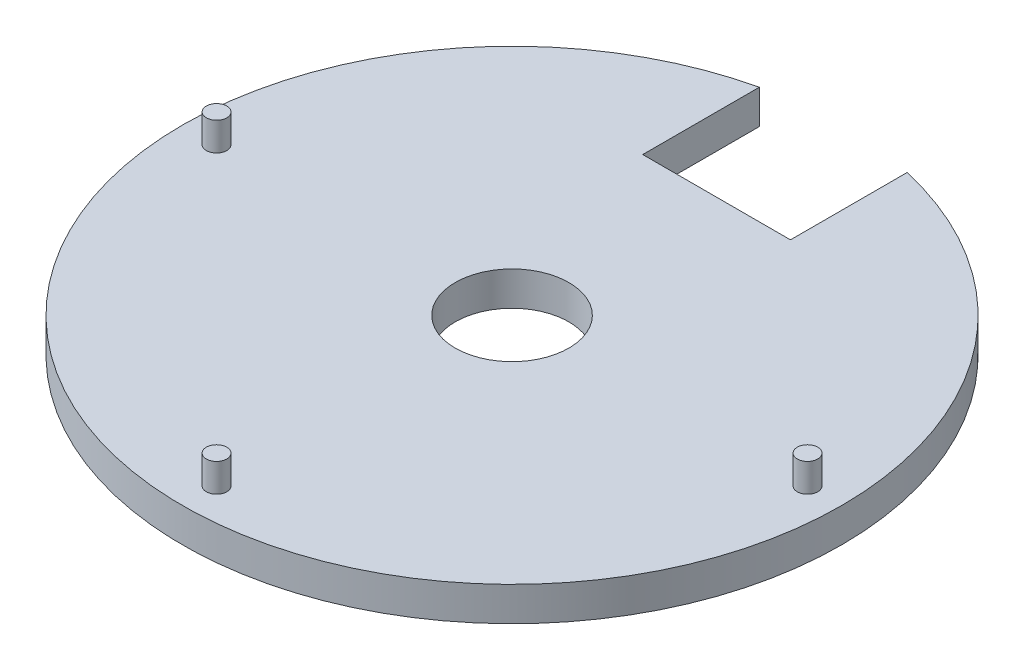
ISO-10303-21;
HEADER;
FILE_DESCRIPTION(('STEP AP214'),'2;1');
FILE_NAME('part.step','',(''),(''),'','','');
FILE_SCHEMA(('AUTOMOTIVE_DESIGN { 1 0 10303 214 1 1 1 1 }'));
ENDSEC;
DATA;
#1=APPLICATION_CONTEXT('core data for automotive mechanical design processes');
#2=APPLICATION_PROTOCOL_DEFINITION('international standard','automotive_design',2000,#1);
#3=PRODUCT_CONTEXT('',#1,'mechanical');
#4=PRODUCT('Part','Part','',(#3));
#5=PRODUCT_RELATED_PRODUCT_CATEGORY('part','',(#4));
#6=PRODUCT_DEFINITION_FORMATION('','',#4);
#7=PRODUCT_DEFINITION_CONTEXT('part definition',#1,'design');
#8=PRODUCT_DEFINITION('design','',#6,#7);
#9=PRODUCT_DEFINITION_SHAPE('','',#8);
#10=(LENGTH_UNIT() NAMED_UNIT(*) SI_UNIT(.MILLI.,.METRE.));
#11=(NAMED_UNIT(*) PLANE_ANGLE_UNIT() SI_UNIT($,.RADIAN.));
#12=(NAMED_UNIT(*) SI_UNIT($,.STERADIAN.) SOLID_ANGLE_UNIT());
#13=UNCERTAINTY_MEASURE_WITH_UNIT(LENGTH_MEASURE(1.E-05),#10,'distance_accuracy_value','');
#14=(GEOMETRIC_REPRESENTATION_CONTEXT(3) GLOBAL_UNCERTAINTY_ASSIGNED_CONTEXT((#13)) GLOBAL_UNIT_ASSIGNED_CONTEXT((#10,
#11,#12)) REPRESENTATION_CONTEXT('',''));
#15=CARTESIAN_POINT('',(0.,0.,0.));
#16=DIRECTION('',(0.,0.,1.));
#17=DIRECTION('',(1.,0.,0.));
#18=AXIS2_PLACEMENT_3D('',#15,#16,#17);
#19=CARTESIAN_POINT('',(0.,3.,0.));
#20=DIRECTION('',(0.,-1.,0.));
#21=DIRECTION('',(0.,0.,-1.));
#22=AXIS2_PLACEMENT_3D('',#19,#20,#21);
#23=CYLINDRICAL_SURFACE('',#22,29.);
#24=DIRECTION('',(0.,-1.,0.));
#25=VECTOR('',#24,1.);
#26=CARTESIAN_POINT('',(6.5,3.,-28.2621655221252));
#27=LINE('',#26,#25);
#28=CARTESIAN_POINT('',(6.5,3.,-28.2621655221252));
#29=VERTEX_POINT('',#28);
#30=CARTESIAN_POINT('',(6.5,0.,-28.2621655221252));
#31=VERTEX_POINT('',#30);
#32=EDGE_CURVE('E56',#29,#31,#27,.T.);
#33=ORIENTED_EDGE('',*,*,#32,.F.);
#34=CARTESIAN_POINT('',(0.,3.,0.));
#35=DIRECTION('',(0.,1.,0.));
#36=DIRECTION('',(0.,0.,1.));
#37=AXIS2_PLACEMENT_3D('',#34,#35,#36);
#38=CIRCLE('',#37,29.);
#39=CARTESIAN_POINT('',(-6.5,3.,-28.2621655221252));
#40=VERTEX_POINT('',#39);
#41=EDGE_CURVE('E42',#40,#29,#38,.T.);
#42=ORIENTED_EDGE('',*,*,#41,.F.);
#43=DIRECTION('',(0.,-1.,0.));
#44=VECTOR('',#43,1.);
#45=CARTESIAN_POINT('',(-6.5,3.,-28.2621655221252));
#46=LINE('',#45,#44);
#47=CARTESIAN_POINT('',(-6.5,0.,-28.2621655221252));
#48=VERTEX_POINT('',#47);
#49=EDGE_CURVE('E86',#48,#40,#46,.F.);
#50=ORIENTED_EDGE('',*,*,#49,.F.);
#51=CARTESIAN_POINT('',(0.,0.,0.));
#52=DIRECTION('',(0.,1.,0.));
#53=DIRECTION('',(0.,0.,1.));
#54=AXIS2_PLACEMENT_3D('',#51,#52,#53);
#55=CIRCLE('',#54,29.);
#56=EDGE_CURVE('E106',#48,#31,#55,.T.);
#57=ORIENTED_EDGE('',*,*,#56,.T.);
#58=EDGE_LOOP('',(#33,#42,#50,#57));
#59=FACE_BOUND('',#58,.T.);
#60=ADVANCED_FACE('F35',(#59),#23,.T.);
#61=CARTESIAN_POINT('',(0.,3.,0.));
#62=DIRECTION('',(0.,1.,0.));
#63=DIRECTION('',(0.,0.,1.));
#64=AXIS2_PLACEMENT_3D('',#61,#62,#63);
#65=PLANE('',#64);
#66=CARTESIAN_POINT('',(0.,3.,0.));
#67=DIRECTION('',(0.,1.,0.));
#68=DIRECTION('',(0.,0.,1.));
#69=AXIS2_PLACEMENT_3D('',#66,#67,#68);
#70=CIRCLE('',#69,5.);
#71=CARTESIAN_POINT('',(0.,3.,5.));
#72=VERTEX_POINT('',#71);
#73=EDGE_CURVE('E165',#72,#72,#70,.T.);
#74=ORIENTED_EDGE('',*,*,#73,.F.);
#75=EDGE_LOOP('',(#74));
#76=FACE_BOUND('',#75,.T.);
#77=CARTESIAN_POINT('',(0.,3.,26.));
#78=DIRECTION('',(0.,1.,0.));
#79=DIRECTION('',(0.,0.,1.));
#80=AXIS2_PLACEMENT_3D('',#77,#78,#79);
#81=CIRCLE('',#80,0.9);
#82=CARTESIAN_POINT('',(0.,3.,26.9));
#83=VERTEX_POINT('',#82);
#84=EDGE_CURVE('E167',#83,#83,#81,.T.);
#85=ORIENTED_EDGE('',*,*,#84,.F.);
#86=EDGE_LOOP('',(#85));
#87=FACE_BOUND('',#86,.T.);
#88=CARTESIAN_POINT('',(26.,3.,0.));
#89=DIRECTION('',(0.,1.,0.));
#90=DIRECTION('',(0.,0.,1.));
#91=AXIS2_PLACEMENT_3D('',#88,#89,#90);
#92=CIRCLE('',#91,0.9);
#93=CARTESIAN_POINT('',(26.,3.,0.9));
#94=VERTEX_POINT('',#93);
#95=EDGE_CURVE('E176',#94,#94,#92,.T.);
#96=ORIENTED_EDGE('',*,*,#95,.F.);
#97=EDGE_LOOP('',(#96));
#98=FACE_BOUND('',#97,.T.);
#99=CARTESIAN_POINT('',(-26.,3.,0.));
#100=DIRECTION('',(0.,1.,0.));
#101=DIRECTION('',(0.,0.,1.));
#102=AXIS2_PLACEMENT_3D('',#99,#100,#101);
#103=CIRCLE('',#102,0.9);
#104=CARTESIAN_POINT('',(-26.,3.,0.900000000000004));
#105=VERTEX_POINT('',#104);
#106=EDGE_CURVE('E96',#105,#105,#103,.T.);
#107=ORIENTED_EDGE('',*,*,#106,.F.);
#108=EDGE_LOOP('',(#107));
#109=FACE_BOUND('',#108,.T.);
#110=ORIENTED_EDGE('',*,*,#41,.T.);
#111=DIRECTION('',(0.,0.,1.));
#112=VECTOR('',#111,1.);
#113=CARTESIAN_POINT('',(6.5,3.,-29.));
#114=LINE('',#113,#112);
#115=CARTESIAN_POINT('',(6.5,3.,-18.));
#116=VERTEX_POINT('',#115);
#117=EDGE_CURVE('E99',#29,#116,#114,.T.);
#118=ORIENTED_EDGE('',*,*,#117,.T.);
#119=DIRECTION('',(-1.,0.,0.));
#120=VECTOR('',#119,1.);
#121=CARTESIAN_POINT('',(6.5,3.,-18.));
#122=LINE('',#121,#120);
#123=CARTESIAN_POINT('',(-6.5,3.,-18.));
#124=VERTEX_POINT('',#123);
#125=EDGE_CURVE('E84',#116,#124,#122,.T.);
#126=ORIENTED_EDGE('',*,*,#125,.T.);
#127=DIRECTION('',(0.,0.,-1.));
#128=VECTOR('',#127,1.);
#129=CARTESIAN_POINT('',(-6.5,3.,-18.));
#130=LINE('',#129,#128);
#131=EDGE_CURVE('E90',#124,#40,#130,.T.);
#132=ORIENTED_EDGE('',*,*,#131,.T.);
#133=EDGE_LOOP('',(#110,#118,#126,#132));
#134=FACE_BOUND('',#133,.T.);
#135=ADVANCED_FACE('F113',(#76,#87,#98,#109,#134),#65,.T.);
#136=CARTESIAN_POINT('',(0.,0.,0.));
#137=DIRECTION('',(0.,1.,0.));
#138=DIRECTION('',(0.,0.,1.));
#139=AXIS2_PLACEMENT_3D('',#136,#137,#138);
#140=PLANE('',#139);
#141=CARTESIAN_POINT('',(0.,0.,0.));
#142=DIRECTION('',(0.,1.,0.));
#143=DIRECTION('',(0.,0.,1.));
#144=AXIS2_PLACEMENT_3D('',#141,#142,#143);
#145=CIRCLE('',#144,5.);
#146=CARTESIAN_POINT('',(0.,0.,5.));
#147=VERTEX_POINT('',#146);
#148=EDGE_CURVE('E163',#147,#147,#145,.T.);
#149=ORIENTED_EDGE('',*,*,#148,.T.);
#150=EDGE_LOOP('',(#149));
#151=FACE_BOUND('',#150,.T.);
#152=DIRECTION('',(0.,0.,1.));
#153=VECTOR('',#152,1.);
#154=CARTESIAN_POINT('',(6.5,0.,0.));
#155=LINE('',#154,#153);
#156=CARTESIAN_POINT('',(6.5,0.,-18.));
#157=VERTEX_POINT('',#156);
#158=EDGE_CURVE('E11',#31,#157,#155,.T.);
#159=ORIENTED_EDGE('',*,*,#158,.F.);
#160=ORIENTED_EDGE('',*,*,#56,.F.);
#161=DIRECTION('',(0.,0.,-1.));
#162=VECTOR('',#161,1.);
#163=CARTESIAN_POINT('',(-6.5,0.,-18.));
#164=LINE('',#163,#162);
#165=CARTESIAN_POINT('',(-6.5,0.,-18.));
#166=VERTEX_POINT('',#165);
#167=EDGE_CURVE('E89',#166,#48,#164,.T.);
#168=ORIENTED_EDGE('',*,*,#167,.F.);
#169=DIRECTION('',(-1.,0.,0.));
#170=VECTOR('',#169,1.);
#171=CARTESIAN_POINT('',(6.5,0.,-18.));
#172=LINE('',#171,#170);
#173=EDGE_CURVE('E81',#157,#166,#172,.T.);
#174=ORIENTED_EDGE('',*,*,#173,.F.);
#175=EDGE_LOOP('',(#159,#160,#168,#174));
#176=FACE_BOUND('',#175,.T.);
#177=ADVANCED_FACE('F88',(#151,#176),#140,.F.);
#178=CARTESIAN_POINT('',(6.5,0.,-29.));
#179=DIRECTION('',(-1.,0.,0.));
#180=DIRECTION('',(0.,0.,1.));
#181=AXIS2_PLACEMENT_3D('',#178,#179,#180);
#182=PLANE('',#181);
#183=ORIENTED_EDGE('',*,*,#32,.T.);
#184=ORIENTED_EDGE('',*,*,#158,.T.);
#185=DIRECTION('',(0.,1.,0.));
#186=VECTOR('',#185,1.);
#187=CARTESIAN_POINT('',(6.5,0.,-18.));
#188=LINE('',#187,#186);
#189=EDGE_CURVE('E73',#157,#116,#188,.T.);
#190=ORIENTED_EDGE('',*,*,#189,.T.);
#191=ORIENTED_EDGE('',*,*,#117,.F.);
#192=EDGE_LOOP('',(#183,#184,#190,#191));
#193=FACE_BOUND('',#192,.T.);
#194=ADVANCED_FACE('F72',(#193),#182,.T.);
#195=CARTESIAN_POINT('',(-6.5,0.,-18.));
#196=DIRECTION('',(1.,0.,0.));
#197=DIRECTION('',(0.,0.,-1.));
#198=AXIS2_PLACEMENT_3D('',#195,#196,#197);
#199=PLANE('',#198);
#200=ORIENTED_EDGE('',*,*,#49,.T.);
#201=ORIENTED_EDGE('',*,*,#131,.F.);
#202=DIRECTION('',(0.,1.,0.));
#203=VECTOR('',#202,1.);
#204=CARTESIAN_POINT('',(-6.5,0.,-18.));
#205=LINE('',#204,#203);
#206=EDGE_CURVE('E49',#166,#124,#205,.T.);
#207=ORIENTED_EDGE('',*,*,#206,.F.);
#208=ORIENTED_EDGE('',*,*,#167,.T.);
#209=EDGE_LOOP('',(#200,#201,#207,#208));
#210=FACE_BOUND('',#209,.T.);
#211=ADVANCED_FACE('F111',(#210),#199,.T.);
#212=CARTESIAN_POINT('',(6.5,0.,-18.));
#213=DIRECTION('',(0.,0.,-1.));
#214=DIRECTION('',(-1.,0.,0.));
#215=AXIS2_PLACEMENT_3D('',#212,#213,#214);
#216=PLANE('',#215);
#217=ORIENTED_EDGE('',*,*,#125,.F.);
#218=ORIENTED_EDGE('',*,*,#189,.F.);
#219=ORIENTED_EDGE('',*,*,#173,.T.);
#220=ORIENTED_EDGE('',*,*,#206,.T.);
#221=EDGE_LOOP('',(#217,#218,#219,#220));
#222=FACE_BOUND('',#221,.T.);
#223=ADVANCED_FACE('F80',(#222),#216,.T.);
#224=CARTESIAN_POINT('',(-26.,5.5,0.));
#225=DIRECTION('',(0.,-1.,0.));
#226=DIRECTION('',(0.,0.,-1.));
#227=AXIS2_PLACEMENT_3D('',#224,#225,#226);
#228=CYLINDRICAL_SURFACE('',#227,0.9);
#229=CARTESIAN_POINT('',(-26.,5.5,0.));
#230=DIRECTION('',(0.,1.,0.));
#231=DIRECTION('',(0.,0.,1.));
#232=AXIS2_PLACEMENT_3D('',#229,#230,#231);
#233=CIRCLE('',#232,0.9);
#234=CARTESIAN_POINT('',(-26.,5.5,0.900000000000004));
#235=VERTEX_POINT('',#234);
#236=EDGE_CURVE('E101',#235,#235,#233,.T.);
#237=ORIENTED_EDGE('',*,*,#236,.F.);
#238=EDGE_LOOP('',(#237));
#239=FACE_BOUND('',#238,.T.);
#240=ORIENTED_EDGE('',*,*,#106,.T.);
#241=EDGE_LOOP('',(#240));
#242=FACE_BOUND('',#241,.T.);
#243=ADVANCED_FACE('F129',(#239,#242),#228,.T.);
#244=CARTESIAN_POINT('',(-26.,5.5,0.));
#245=DIRECTION('',(0.,1.,0.));
#246=DIRECTION('',(0.,0.,1.));
#247=AXIS2_PLACEMENT_3D('',#244,#245,#246);
#248=PLANE('',#247);
#249=ORIENTED_EDGE('',*,*,#236,.T.);
#250=EDGE_LOOP('',(#249));
#251=FACE_BOUND('',#250,.T.);
#252=ADVANCED_FACE('F134',(#251),#248,.T.);
#253=CARTESIAN_POINT('',(26.,5.5,0.));
#254=DIRECTION('',(0.,-1.,0.));
#255=DIRECTION('',(0.,0.,-1.));
#256=AXIS2_PLACEMENT_3D('',#253,#254,#255);
#257=CYLINDRICAL_SURFACE('',#256,0.9);
#258=CARTESIAN_POINT('',(26.,5.5,0.));
#259=DIRECTION('',(0.,1.,0.));
#260=DIRECTION('',(0.,0.,1.));
#261=AXIS2_PLACEMENT_3D('',#258,#259,#260);
#262=CIRCLE('',#261,0.9);
#263=CARTESIAN_POINT('',(26.,5.5,0.9));
#264=VERTEX_POINT('',#263);
#265=EDGE_CURVE('E173',#264,#264,#262,.T.);
#266=ORIENTED_EDGE('',*,*,#265,.F.);
#267=EDGE_LOOP('',(#266));
#268=FACE_BOUND('',#267,.T.);
#269=ORIENTED_EDGE('',*,*,#95,.T.);
#270=EDGE_LOOP('',(#269));
#271=FACE_BOUND('',#270,.T.);
#272=ADVANCED_FACE('F138',(#268,#271),#257,.T.);
#273=CARTESIAN_POINT('',(26.,5.5,0.));
#274=DIRECTION('',(0.,1.,0.));
#275=DIRECTION('',(0.,0.,1.));
#276=AXIS2_PLACEMENT_3D('',#273,#274,#275);
#277=PLANE('',#276);
#278=ORIENTED_EDGE('',*,*,#265,.T.);
#279=EDGE_LOOP('',(#278));
#280=FACE_BOUND('',#279,.T.);
#281=ADVANCED_FACE('F140',(#280),#277,.T.);
#282=CARTESIAN_POINT('',(0.,5.5,26.));
#283=DIRECTION('',(0.,-1.,0.));
#284=DIRECTION('',(0.,0.,-1.));
#285=AXIS2_PLACEMENT_3D('',#282,#283,#284);
#286=CYLINDRICAL_SURFACE('',#285,0.9);
#287=CARTESIAN_POINT('',(0.,5.5,26.));
#288=DIRECTION('',(0.,1.,0.));
#289=DIRECTION('',(0.,0.,1.));
#290=AXIS2_PLACEMENT_3D('',#287,#288,#289);
#291=CIRCLE('',#290,0.9);
#292=CARTESIAN_POINT('',(0.,5.5,26.9));
#293=VERTEX_POINT('',#292);
#294=EDGE_CURVE('E170',#293,#293,#291,.T.);
#295=ORIENTED_EDGE('',*,*,#294,.F.);
#296=EDGE_LOOP('',(#295));
#297=FACE_BOUND('',#296,.T.);
#298=ORIENTED_EDGE('',*,*,#84,.T.);
#299=EDGE_LOOP('',(#298));
#300=FACE_BOUND('',#299,.T.);
#301=ADVANCED_FACE('F143',(#297,#300),#286,.T.);
#302=CARTESIAN_POINT('',(0.,5.5,26.));
#303=DIRECTION('',(0.,1.,0.));
#304=DIRECTION('',(0.,0.,1.));
#305=AXIS2_PLACEMENT_3D('',#302,#303,#304);
#306=PLANE('',#305);
#307=ORIENTED_EDGE('',*,*,#294,.T.);
#308=EDGE_LOOP('',(#307));
#309=FACE_BOUND('',#308,.T.);
#310=ADVANCED_FACE('F150',(#309),#306,.T.);
#311=CARTESIAN_POINT('',(0.,0.,0.));
#312=DIRECTION('',(0.,1.,0.));
#313=DIRECTION('',(0.,0.,1.));
#314=AXIS2_PLACEMENT_3D('',#311,#312,#313);
#315=CYLINDRICAL_SURFACE('',#314,5.);
#316=ORIENTED_EDGE('',*,*,#148,.F.);
#317=EDGE_LOOP('',(#316));
#318=FACE_BOUND('',#317,.T.);
#319=ORIENTED_EDGE('',*,*,#73,.T.);
#320=EDGE_LOOP('',(#319));
#321=FACE_BOUND('',#320,.T.);
#322=ADVANCED_FACE('F154',(#318,#321),#315,.F.);
#323=CLOSED_SHELL('',(#60,#135,#177,#194,#211,#223,#243,#252,#272,#281,#301,#310,#322));
#324=MANIFOLD_SOLID_BREP('B2',#323);
#325=ADVANCED_BREP_SHAPE_REPRESENTATION('',(#18,#324),#14);
#326=SHAPE_DEFINITION_REPRESENTATION(#9,#325);
ENDSEC;
END-ISO-10303-21;
